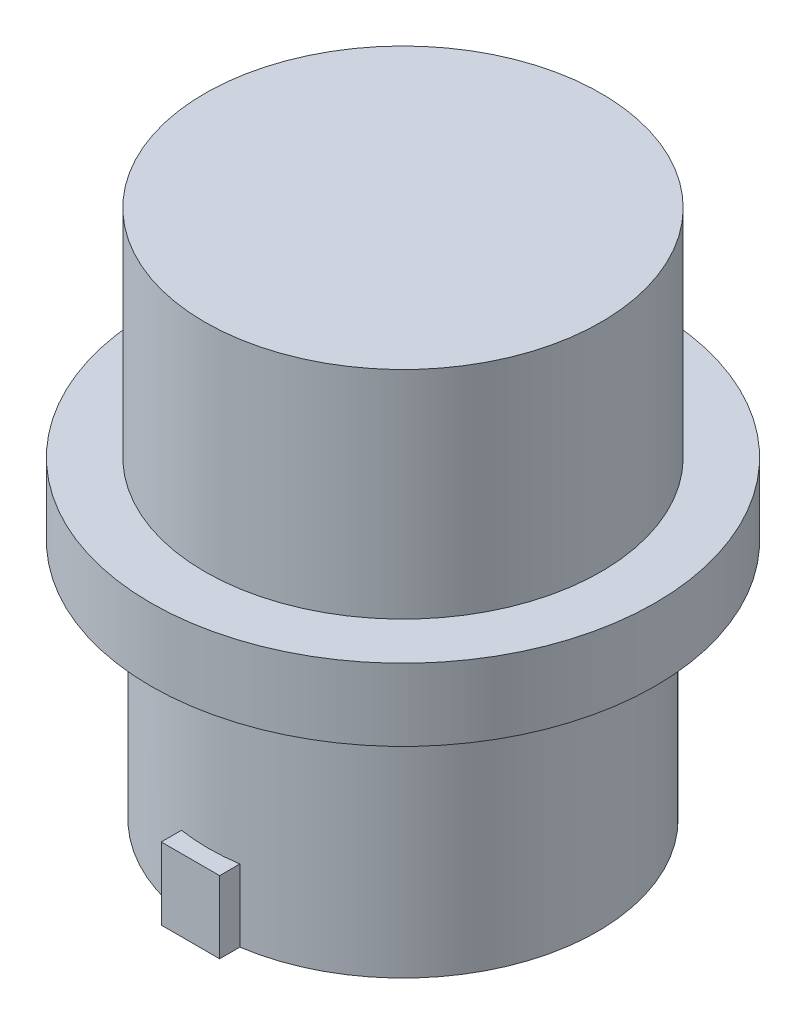
ISO-10303-21;
HEADER;
FILE_DESCRIPTION(('STEP AP214'),'2;1');
FILE_NAME('part.step','',(''),(''),'','','');
FILE_SCHEMA(('AUTOMOTIVE_DESIGN { 1 0 10303 214 1 1 1 1 }'));
ENDSEC;
DATA;
#1=APPLICATION_CONTEXT('core data for automotive mechanical design processes');
#2=APPLICATION_PROTOCOL_DEFINITION('international standard','automotive_design',2000,#1);
#3=PRODUCT_CONTEXT('',#1,'mechanical');
#4=PRODUCT('Part','Part','',(#3));
#5=PRODUCT_RELATED_PRODUCT_CATEGORY('part','',(#4));
#6=PRODUCT_DEFINITION_FORMATION('','',#4);
#7=PRODUCT_DEFINITION_CONTEXT('part definition',#1,'design');
#8=PRODUCT_DEFINITION('design','',#6,#7);
#9=PRODUCT_DEFINITION_SHAPE('','',#8);
#10=(LENGTH_UNIT() NAMED_UNIT(*) SI_UNIT(.MILLI.,.METRE.));
#11=(NAMED_UNIT(*) PLANE_ANGLE_UNIT() SI_UNIT($,.RADIAN.));
#12=(NAMED_UNIT(*) SI_UNIT($,.STERADIAN.) SOLID_ANGLE_UNIT());
#13=UNCERTAINTY_MEASURE_WITH_UNIT(LENGTH_MEASURE(1.E-05),#10,'distance_accuracy_value','');
#14=(GEOMETRIC_REPRESENTATION_CONTEXT(3) GLOBAL_UNCERTAINTY_ASSIGNED_CONTEXT((#13)) GLOBAL_UNIT_ASSIGNED_CONTEXT((#10,
#11,#12)) REPRESENTATION_CONTEXT('',''));
#15=CARTESIAN_POINT('',(0.,0.,0.));
#16=DIRECTION('',(0.,0.,1.));
#17=DIRECTION('',(1.,0.,0.));
#18=AXIS2_PLACEMENT_3D('',#15,#16,#17);
#19=CARTESIAN_POINT('',(0.,2.,0.));
#20=DIRECTION('',(0.,-1.,0.));
#21=DIRECTION('',(0.,0.,-1.));
#22=AXIS2_PLACEMENT_3D('',#19,#20,#21);
#23=CYLINDRICAL_SURFACE('',#22,7.);
#24=CARTESIAN_POINT('',(0.,2.,0.));
#25=DIRECTION('',(0.,1.,0.));
#26=DIRECTION('',(0.,0.,1.));
#27=AXIS2_PLACEMENT_3D('',#24,#25,#26);
#28=CIRCLE('',#27,7.);
#29=CARTESIAN_POINT('',(0.,2.,7.));
#30=VERTEX_POINT('',#29);
#31=EDGE_CURVE('E136',#30,#30,#28,.T.);
#32=ORIENTED_EDGE('',*,*,#31,.F.);
#33=EDGE_LOOP('',(#32));
#34=FACE_BOUND('',#33,.T.);
#35=CARTESIAN_POINT('',(0.,0.,0.));
#36=DIRECTION('',(0.,1.,0.));
#37=DIRECTION('',(0.,0.,1.));
#38=AXIS2_PLACEMENT_3D('',#35,#36,#37);
#39=CIRCLE('',#38,7.);
#40=CARTESIAN_POINT('',(0.,0.,7.));
#41=VERTEX_POINT('',#40);
#42=EDGE_CURVE('E132',#41,#41,#39,.T.);
#43=ORIENTED_EDGE('',*,*,#42,.T.);
#44=EDGE_LOOP('',(#43));
#45=FACE_BOUND('',#44,.T.);
#46=ADVANCED_FACE('F39',(#34,#45),#23,.T.);
#47=CARTESIAN_POINT('',(0.,2.,0.));
#48=DIRECTION('',(0.,1.,0.));
#49=DIRECTION('',(0.,0.,1.));
#50=AXIS2_PLACEMENT_3D('',#47,#48,#49);
#51=PLANE('',#50);
#52=CARTESIAN_POINT('',(0.,2.,0.));
#53=DIRECTION('',(0.,1.,0.));
#54=DIRECTION('',(0.,0.,1.));
#55=AXIS2_PLACEMENT_3D('',#52,#53,#54);
#56=CIRCLE('',#55,5.5);
#57=CARTESIAN_POINT('',(0.,2.,5.5));
#58=VERTEX_POINT('',#57);
#59=EDGE_CURVE('E128',#58,#58,#56,.T.);
#60=ORIENTED_EDGE('',*,*,#59,.F.);
#61=EDGE_LOOP('',(#60));
#62=FACE_BOUND('',#61,.T.);
#63=ORIENTED_EDGE('',*,*,#31,.T.);
#64=EDGE_LOOP('',(#63));
#65=FACE_BOUND('',#64,.T.);
#66=ADVANCED_FACE('F147',(#62,#65),#51,.T.);
#67=CARTESIAN_POINT('',(0.,0.,0.));
#68=DIRECTION('',(0.,1.,0.));
#69=DIRECTION('',(0.,0.,1.));
#70=AXIS2_PLACEMENT_3D('',#67,#68,#69);
#71=PLANE('',#70);
#72=CARTESIAN_POINT('',(0.,0.,0.));
#73=DIRECTION('',(0.,-1.,0.));
#74=DIRECTION('',(0.,0.,-1.));
#75=AXIS2_PLACEMENT_3D('',#72,#73,#74);
#76=CIRCLE('',#75,5.4);
#77=CARTESIAN_POINT('',(0.,0.,-5.4));
#78=VERTEX_POINT('',#77);
#79=EDGE_CURVE('E47',#78,#78,#76,.T.);
#80=ORIENTED_EDGE('',*,*,#79,.F.);
#81=EDGE_LOOP('',(#80));
#82=FACE_BOUND('',#81,.T.);
#83=ORIENTED_EDGE('',*,*,#42,.F.);
#84=EDGE_LOOP('',(#83));
#85=FACE_BOUND('',#84,.T.);
#86=ADVANCED_FACE('F144',(#82,#85),#71,.F.);
#87=CARTESIAN_POINT('',(0.,8.,0.));
#88=DIRECTION('',(0.,-1.,0.));
#89=DIRECTION('',(0.,0.,-1.));
#90=AXIS2_PLACEMENT_3D('',#87,#88,#89);
#91=CYLINDRICAL_SURFACE('',#90,5.5);
#92=CARTESIAN_POINT('',(0.,8.,0.));
#93=DIRECTION('',(0.,1.,0.));
#94=DIRECTION('',(0.,0.,1.));
#95=AXIS2_PLACEMENT_3D('',#92,#93,#94);
#96=CIRCLE('',#95,5.5);
#97=CARTESIAN_POINT('',(0.,8.,5.5));
#98=VERTEX_POINT('',#97);
#99=EDGE_CURVE('E124',#98,#98,#96,.T.);
#100=ORIENTED_EDGE('',*,*,#99,.F.);
#101=EDGE_LOOP('',(#100));
#102=FACE_BOUND('',#101,.T.);
#103=ORIENTED_EDGE('',*,*,#59,.T.);
#104=EDGE_LOOP('',(#103));
#105=FACE_BOUND('',#104,.T.);
#106=ADVANCED_FACE('F146',(#102,#105),#91,.T.);
#107=CARTESIAN_POINT('',(0.,8.,0.));
#108=DIRECTION('',(0.,1.,0.));
#109=DIRECTION('',(0.,0.,1.));
#110=AXIS2_PLACEMENT_3D('',#107,#108,#109);
#111=PLANE('',#110);
#112=ORIENTED_EDGE('',*,*,#99,.T.);
#113=EDGE_LOOP('',(#112));
#114=FACE_BOUND('',#113,.T.);
#115=ADVANCED_FACE('F153',(#114),#111,.T.);
#116=CARTESIAN_POINT('',(0.,-6.7,0.));
#117=DIRECTION('',(0.,1.,0.));
#118=DIRECTION('',(0.,0.,1.));
#119=AXIS2_PLACEMENT_3D('',#116,#117,#118);
#120=CYLINDRICAL_SURFACE('',#119,5.4);
#121=CARTESIAN_POINT('',(0.,-4.7,0.));
#122=DIRECTION('',(0.,1.,0.));
#123=DIRECTION('',(0.,0.,1.));
#124=AXIS2_PLACEMENT_3D('',#121,#122,#123);
#125=CIRCLE('',#124,5.4);
#126=CARTESIAN_POINT('',(-0.809982981206644,-4.7,5.33890696399137));
#127=VERTEX_POINT('',#126);
#128=CARTESIAN_POINT('',(0.809982981206643,-4.7,5.33890696399137));
#129=VERTEX_POINT('',#128);
#130=EDGE_CURVE('E11',#127,#129,#125,.T.);
#131=ORIENTED_EDGE('',*,*,#130,.T.);
#132=DIRECTION('',(0.,1.,0.));
#133=VECTOR('',#132,1.);
#134=CARTESIAN_POINT('',(0.809982981206643,-6.7,5.33890696399137));
#135=LINE('',#134,#133);
#136=CARTESIAN_POINT('',(0.809982981206643,-6.7,5.33890696399137));
#137=VERTEX_POINT('',#136);
#138=EDGE_CURVE('E62',#129,#137,#135,.F.);
#139=ORIENTED_EDGE('',*,*,#138,.T.);
#140=CARTESIAN_POINT('',(0.,-6.7,0.));
#141=DIRECTION('',(0.,-1.,0.));
#142=DIRECTION('',(0.,0.,-1.));
#143=AXIS2_PLACEMENT_3D('',#140,#141,#142);
#144=CIRCLE('',#143,5.4);
#145=CARTESIAN_POINT('',(-0.809982981206644,-6.7,5.33890696399137));
#146=VERTEX_POINT('',#145);
#147=EDGE_CURVE('E121',#146,#137,#144,.T.);
#148=ORIENTED_EDGE('',*,*,#147,.F.);
#149=DIRECTION('',(0.,1.,0.));
#150=VECTOR('',#149,1.);
#151=CARTESIAN_POINT('',(-0.809982981206644,-6.7,5.33890696399137));
#152=LINE('',#151,#150);
#153=EDGE_CURVE('E114',#146,#127,#152,.T.);
#154=ORIENTED_EDGE('',*,*,#153,.T.);
#155=EDGE_LOOP('',(#131,#139,#148,#154));
#156=FACE_BOUND('',#155,.T.);
#157=ORIENTED_EDGE('',*,*,#79,.T.);
#158=EDGE_LOOP('',(#157));
#159=FACE_BOUND('',#158,.T.);
#160=ADVANCED_FACE('F184',(#156,#159),#120,.T.);
#161=CARTESIAN_POINT('',(0.,-6.7,0.));
#162=DIRECTION('',(0.,-1.,0.));
#163=DIRECTION('',(0.,0.,-1.));
#164=AXIS2_PLACEMENT_3D('',#161,#162,#163);
#165=PLANE('',#164);
#166=ORIENTED_EDGE('',*,*,#147,.T.);
#167=DIRECTION('',(0.,0.,1.));
#168=VECTOR('',#167,1.);
#169=CARTESIAN_POINT('',(0.809982981206643,-6.7,4.9));
#170=LINE('',#169,#168);
#171=CARTESIAN_POINT('',(0.809982981206643,-6.7,5.9));
#172=VERTEX_POINT('',#171);
#173=EDGE_CURVE('E106',#137,#172,#170,.T.);
#174=ORIENTED_EDGE('',*,*,#173,.T.);
#175=DIRECTION('',(-1.,0.,0.));
#176=VECTOR('',#175,1.);
#177=CARTESIAN_POINT('',(-0.809982981206644,-6.7,5.9));
#178=LINE('',#177,#176);
#179=CARTESIAN_POINT('',(-0.809982981206644,-6.7,5.9));
#180=VERTEX_POINT('',#179);
#181=EDGE_CURVE('E93',#172,#180,#178,.T.);
#182=ORIENTED_EDGE('',*,*,#181,.T.);
#183=DIRECTION('',(0.,0.,-1.));
#184=VECTOR('',#183,1.);
#185=CARTESIAN_POINT('',(-0.809982981206644,-6.7,4.9));
#186=LINE('',#185,#184);
#187=EDGE_CURVE('E54',#180,#146,#186,.T.);
#188=ORIENTED_EDGE('',*,*,#187,.T.);
#189=EDGE_LOOP('',(#166,#174,#182,#188));
#190=FACE_BOUND('',#189,.T.);
#191=ADVANCED_FACE('F198',(#190),#165,.T.);
#192=CARTESIAN_POINT('',(0.809982981206643,-4.7,4.9));
#193=DIRECTION('',(1.,0.,0.));
#194=DIRECTION('',(0.,0.,-1.));
#195=AXIS2_PLACEMENT_3D('',#192,#193,#194);
#196=PLANE('',#195);
#197=ORIENTED_EDGE('',*,*,#138,.F.);
#198=DIRECTION('',(0.,0.,1.));
#199=VECTOR('',#198,1.);
#200=CARTESIAN_POINT('',(0.809982981206643,-4.7,4.9));
#201=LINE('',#200,#199);
#202=CARTESIAN_POINT('',(0.809982981206643,-4.7,5.9));
#203=VERTEX_POINT('',#202);
#204=EDGE_CURVE('E80',#129,#203,#201,.T.);
#205=ORIENTED_EDGE('',*,*,#204,.T.);
#206=DIRECTION('',(0.,-1.,0.));
#207=VECTOR('',#206,1.);
#208=CARTESIAN_POINT('',(0.809982981206643,-4.7,5.9));
#209=LINE('',#208,#207);
#210=EDGE_CURVE('E83',#203,#172,#209,.T.);
#211=ORIENTED_EDGE('',*,*,#210,.T.);
#212=ORIENTED_EDGE('',*,*,#173,.F.);
#213=EDGE_LOOP('',(#197,#205,#211,#212));
#214=FACE_BOUND('',#213,.T.);
#215=ADVANCED_FACE('F82',(#214),#196,.T.);
#216=CARTESIAN_POINT('',(-0.809982981206644,-4.7,4.9));
#217=DIRECTION('',(-1.,0.,0.));
#218=DIRECTION('',(0.,0.,1.));
#219=AXIS2_PLACEMENT_3D('',#216,#217,#218);
#220=PLANE('',#219);
#221=ORIENTED_EDGE('',*,*,#153,.F.);
#222=ORIENTED_EDGE('',*,*,#187,.F.);
#223=DIRECTION('',(0.,-1.,0.));
#224=VECTOR('',#223,1.);
#225=CARTESIAN_POINT('',(-0.809982981206644,-4.7,5.9));
#226=LINE('',#225,#224);
#227=CARTESIAN_POINT('',(-0.809982981206644,-4.7,5.9));
#228=VERTEX_POINT('',#227);
#229=EDGE_CURVE('E95',#228,#180,#226,.T.);
#230=ORIENTED_EDGE('',*,*,#229,.F.);
#231=DIRECTION('',(0.,0.,-1.));
#232=VECTOR('',#231,1.);
#233=CARTESIAN_POINT('',(-0.809982981206644,-4.7,4.9));
#234=LINE('',#233,#232);
#235=EDGE_CURVE('E96',#228,#127,#234,.T.);
#236=ORIENTED_EDGE('',*,*,#235,.T.);
#237=EDGE_LOOP('',(#221,#222,#230,#236));
#238=FACE_BOUND('',#237,.T.);
#239=ADVANCED_FACE('F217',(#238),#220,.T.);
#240=CARTESIAN_POINT('',(-0.809982981206644,-4.7,5.9));
#241=DIRECTION('',(0.,0.,1.));
#242=DIRECTION('',(1.,0.,0.));
#243=AXIS2_PLACEMENT_3D('',#240,#241,#242);
#244=PLANE('',#243);
#245=ORIENTED_EDGE('',*,*,#181,.F.);
#246=ORIENTED_EDGE('',*,*,#210,.F.);
#247=DIRECTION('',(-1.,0.,0.));
#248=VECTOR('',#247,1.);
#249=CARTESIAN_POINT('',(-0.809982981206644,-4.7,5.9));
#250=LINE('',#249,#248);
#251=EDGE_CURVE('E88',#203,#228,#250,.T.);
#252=ORIENTED_EDGE('',*,*,#251,.T.);
#253=ORIENTED_EDGE('',*,*,#229,.T.);
#254=EDGE_LOOP('',(#245,#246,#252,#253));
#255=FACE_BOUND('',#254,.T.);
#256=ADVANCED_FACE('F92',(#255),#244,.T.);
#257=CARTESIAN_POINT('',(0.,-4.7,0.));
#258=DIRECTION('',(0.,1.,0.));
#259=DIRECTION('',(0.,0.,1.));
#260=AXIS2_PLACEMENT_3D('',#257,#258,#259);
#261=PLANE('',#260);
#262=ORIENTED_EDGE('',*,*,#130,.F.);
#263=ORIENTED_EDGE('',*,*,#235,.F.);
#264=ORIENTED_EDGE('',*,*,#251,.F.);
#265=ORIENTED_EDGE('',*,*,#204,.F.);
#266=EDGE_LOOP('',(#262,#263,#264,#265));
#267=FACE_BOUND('',#266,.T.);
#268=ADVANCED_FACE('F99',(#267),#261,.T.);
#269=CLOSED_SHELL('',(#46,#66,#86,#106,#115,#160,#191,#215,#239,#256,#268));
#270=MANIFOLD_SOLID_BREP('B2',#269);
#271=ADVANCED_BREP_SHAPE_REPRESENTATION('',(#18,#270),#14);
#272=SHAPE_DEFINITION_REPRESENTATION(#9,#271);
ENDSEC;
END-ISO-10303-21;
